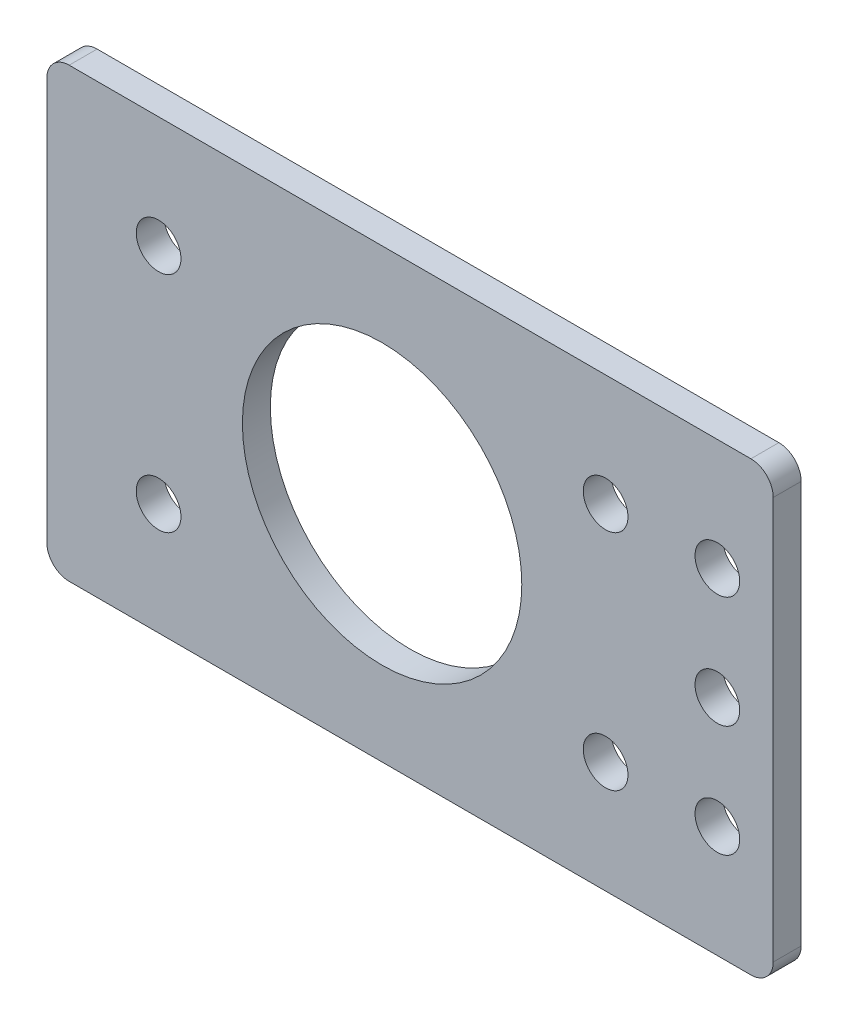
ISO-10303-21;
HEADER;
FILE_DESCRIPTION(('STEP AP214'),'2;1');
FILE_NAME('part.step','',(''),(''),'','','');
FILE_SCHEMA(('AUTOMOTIVE_DESIGN { 1 0 10303 214 1 1 1 1 }'));
ENDSEC;
DATA;
#1=APPLICATION_CONTEXT('core data for automotive mechanical design processes');
#2=APPLICATION_PROTOCOL_DEFINITION('international standard','automotive_design',2000,#1);
#3=PRODUCT_CONTEXT('',#1,'mechanical');
#4=PRODUCT('Part','Part','',(#3));
#5=PRODUCT_RELATED_PRODUCT_CATEGORY('part','',(#4));
#6=PRODUCT_DEFINITION_FORMATION('','',#4);
#7=PRODUCT_DEFINITION_CONTEXT('part definition',#1,'design');
#8=PRODUCT_DEFINITION('design','',#6,#7);
#9=PRODUCT_DEFINITION_SHAPE('','',#8);
#10=(LENGTH_UNIT() NAMED_UNIT(*) SI_UNIT(.MILLI.,.METRE.));
#11=(NAMED_UNIT(*) PLANE_ANGLE_UNIT() SI_UNIT($,.RADIAN.));
#12=(NAMED_UNIT(*) SI_UNIT($,.STERADIAN.) SOLID_ANGLE_UNIT());
#13=UNCERTAINTY_MEASURE_WITH_UNIT(LENGTH_MEASURE(1.E-05),#10,'distance_accuracy_value','');
#14=(GEOMETRIC_REPRESENTATION_CONTEXT(3) GLOBAL_UNCERTAINTY_ASSIGNED_CONTEXT((#13)) GLOBAL_UNIT_ASSIGNED_CONTEXT((#10,
#11,#12)) REPRESENTATION_CONTEXT('',''));
#15=CARTESIAN_POINT('',(0.,0.,0.));
#16=DIRECTION('',(0.,0.,1.));
#17=DIRECTION('',(1.,0.,0.));
#18=AXIS2_PLACEMENT_3D('',#15,#16,#17);
#19=CARTESIAN_POINT('',(0.,0.,3.175));
#20=DIRECTION('',(0.,0.,-1.));
#21=DIRECTION('',(-1.,0.,0.));
#22=AXIS2_PLACEMENT_3D('',#19,#20,#21);
#23=PLANE('',#22);
#24=CARTESIAN_POINT('',(-444.5,12.7,3.175));
#25=DIRECTION('',(0.,0.,1.));
#26=DIRECTION('',(1.,0.,0.));
#27=AXIS2_PLACEMENT_3D('',#24,#25,#26);
#28=CIRCLE('',#27,2.54000000000001);
#29=CARTESIAN_POINT('',(-441.96,12.7,3.175));
#30=VERTEX_POINT('',#29);
#31=EDGE_CURVE('E171',#30,#30,#28,.T.);
#32=ORIENTED_EDGE('',*,*,#31,.F.);
#33=EDGE_LOOP('',(#32));
#34=FACE_BOUND('',#33,.T.);
#35=CARTESIAN_POINT('',(-431.8,12.7,3.175));
#36=DIRECTION('',(0.,0.,1.));
#37=DIRECTION('',(1.,0.,0.));
#38=AXIS2_PLACEMENT_3D('',#35,#36,#37);
#39=CIRCLE('',#38,2.54000000000001);
#40=CARTESIAN_POINT('',(-429.26,12.7,3.175));
#41=VERTEX_POINT('',#40);
#42=EDGE_CURVE('E177',#41,#41,#39,.T.);
#43=ORIENTED_EDGE('',*,*,#42,.F.);
#44=EDGE_LOOP('',(#43));
#45=FACE_BOUND('',#44,.T.);
#46=CARTESIAN_POINT('',(-431.8,0.,3.175));
#47=DIRECTION('',(0.,0.,1.));
#48=DIRECTION('',(1.,0.,0.));
#49=AXIS2_PLACEMENT_3D('',#46,#47,#48);
#50=CIRCLE('',#49,2.54000000000001);
#51=CARTESIAN_POINT('',(-429.26,0.,3.175));
#52=VERTEX_POINT('',#51);
#53=EDGE_CURVE('E183',#52,#52,#50,.T.);
#54=ORIENTED_EDGE('',*,*,#53,.F.);
#55=EDGE_LOOP('',(#54));
#56=FACE_BOUND('',#55,.T.);
#57=CARTESIAN_POINT('',(-431.8,-12.7,3.175));
#58=DIRECTION('',(0.,0.,1.));
#59=DIRECTION('',(1.,0.,0.));
#60=AXIS2_PLACEMENT_3D('',#57,#58,#59);
#61=CIRCLE('',#60,2.54000000000001);
#62=CARTESIAN_POINT('',(-429.26,-12.7,3.175));
#63=VERTEX_POINT('',#62);
#64=EDGE_CURVE('E189',#63,#63,#61,.T.);
#65=ORIENTED_EDGE('',*,*,#64,.F.);
#66=EDGE_LOOP('',(#65));
#67=FACE_BOUND('',#66,.T.);
#68=CARTESIAN_POINT('',(-444.5,-12.7,3.175));
#69=DIRECTION('',(0.,0.,1.));
#70=DIRECTION('',(1.,0.,0.));
#71=AXIS2_PLACEMENT_3D('',#68,#69,#70);
#72=CIRCLE('',#71,2.54000000000001);
#73=CARTESIAN_POINT('',(-441.96,-12.7,3.175));
#74=VERTEX_POINT('',#73);
#75=EDGE_CURVE('E195',#74,#74,#72,.T.);
#76=ORIENTED_EDGE('',*,*,#75,.F.);
#77=EDGE_LOOP('',(#76));
#78=FACE_BOUND('',#77,.T.);
#79=CARTESIAN_POINT('',(-495.3,-12.7,3.175));
#80=DIRECTION('',(0.,0.,1.));
#81=DIRECTION('',(1.,0.,0.));
#82=AXIS2_PLACEMENT_3D('',#79,#80,#81);
#83=CIRCLE('',#82,2.54000000000001);
#84=CARTESIAN_POINT('',(-492.76,-12.7,3.175));
#85=VERTEX_POINT('',#84);
#86=EDGE_CURVE('E201',#85,#85,#83,.T.);
#87=ORIENTED_EDGE('',*,*,#86,.F.);
#88=EDGE_LOOP('',(#87));
#89=FACE_BOUND('',#88,.T.);
#90=CARTESIAN_POINT('',(-495.3,12.7,3.175));
#91=DIRECTION('',(0.,0.,1.));
#92=DIRECTION('',(1.,0.,0.));
#93=AXIS2_PLACEMENT_3D('',#90,#91,#92);
#94=CIRCLE('',#93,2.54000000000001);
#95=CARTESIAN_POINT('',(-492.76,12.7,3.175));
#96=VERTEX_POINT('',#95);
#97=EDGE_CURVE('E207',#96,#96,#94,.T.);
#98=ORIENTED_EDGE('',*,*,#97,.F.);
#99=EDGE_LOOP('',(#98));
#100=FACE_BOUND('',#99,.T.);
#101=CARTESIAN_POINT('',(-469.9,0.,3.175));
#102=DIRECTION('',(0.,0.,1.));
#103=DIRECTION('',(1.,0.,0.));
#104=AXIS2_PLACEMENT_3D('',#101,#102,#103);
#105=CIRCLE('',#104,15.875);
#106=CARTESIAN_POINT('',(-454.025,0.,3.175));
#107=VERTEX_POINT('',#106);
#108=EDGE_CURVE('E213',#107,#107,#105,.T.);
#109=ORIENTED_EDGE('',*,*,#108,.F.);
#110=EDGE_LOOP('',(#109));
#111=FACE_BOUND('',#110,.T.);
#112=DIRECTION('',(1.,0.,0.));
#113=VECTOR('',#112,1.);
#114=CARTESIAN_POINT('',(-481.624580264318,-25.4,3.175));
#115=LINE('',#114,#113);
#116=CARTESIAN_POINT('',(-505.46,-25.4,3.175));
#117=VERTEX_POINT('',#116);
#118=CARTESIAN_POINT('',(-427.99,-25.4000000000001,3.175));
#119=VERTEX_POINT('',#118);
#120=EDGE_CURVE('E120',#117,#119,#115,.T.);
#121=ORIENTED_EDGE('',*,*,#120,.T.);
#122=CARTESIAN_POINT('',(-427.99,-22.86,3.175));
#123=DIRECTION('',(0.,0.,-1.));
#124=DIRECTION('',(-1.,0.,0.));
#125=AXIS2_PLACEMENT_3D('',#122,#123,#124);
#126=CIRCLE('',#125,2.54);
#127=CARTESIAN_POINT('',(-425.45,-22.86,3.175));
#128=VERTEX_POINT('',#127);
#129=EDGE_CURVE('E140',#119,#128,#126,.F.);
#130=ORIENTED_EDGE('',*,*,#129,.T.);
#131=DIRECTION('',(0.,1.,0.));
#132=VECTOR('',#131,1.);
#133=CARTESIAN_POINT('',(-425.45,25.4,3.175));
#134=LINE('',#133,#132);
#135=CARTESIAN_POINT('',(-425.45,22.8599999999999,3.175));
#136=VERTEX_POINT('',#135);
#137=EDGE_CURVE('E163',#128,#136,#134,.T.);
#138=ORIENTED_EDGE('',*,*,#137,.T.);
#139=CARTESIAN_POINT('',(-427.99,22.8599999999999,3.175));
#140=DIRECTION('',(0.,0.,-1.));
#141=DIRECTION('',(-1.,0.,0.));
#142=AXIS2_PLACEMENT_3D('',#139,#140,#141);
#143=CIRCLE('',#142,2.54);
#144=CARTESIAN_POINT('',(-427.99,25.4,3.175));
#145=VERTEX_POINT('',#144);
#146=EDGE_CURVE('E138',#136,#145,#143,.F.);
#147=ORIENTED_EDGE('',*,*,#146,.T.);
#148=DIRECTION('',(-1.,0.,0.));
#149=VECTOR('',#148,1.);
#150=CARTESIAN_POINT('',(-431.8,25.4,3.175));
#151=LINE('',#150,#149);
#152=CARTESIAN_POINT('',(-505.46,25.4,3.175));
#153=VERTEX_POINT('',#152);
#154=EDGE_CURVE('E118',#145,#153,#151,.T.);
#155=ORIENTED_EDGE('',*,*,#154,.T.);
#156=CARTESIAN_POINT('',(-505.46,22.86,3.175));
#157=DIRECTION('',(0.,0.,-1.));
#158=DIRECTION('',(-1.,0.,0.));
#159=AXIS2_PLACEMENT_3D('',#156,#157,#158);
#160=CIRCLE('',#159,2.54);
#161=CARTESIAN_POINT('',(-508.,22.86,3.175));
#162=VERTEX_POINT('',#161);
#163=EDGE_CURVE('E117',#153,#162,#160,.F.);
#164=ORIENTED_EDGE('',*,*,#163,.T.);
#165=DIRECTION('',(0.,-1.,0.));
#166=VECTOR('',#165,1.);
#167=CARTESIAN_POINT('',(-508.,25.4,3.175));
#168=LINE('',#167,#166);
#169=CARTESIAN_POINT('',(-508.,-22.86,3.175));
#170=VERTEX_POINT('',#169);
#171=EDGE_CURVE('E103',#162,#170,#168,.T.);
#172=ORIENTED_EDGE('',*,*,#171,.T.);
#173=CARTESIAN_POINT('',(-505.46,-22.86,3.175));
#174=DIRECTION('',(0.,0.,-1.));
#175=DIRECTION('',(-1.,0.,0.));
#176=AXIS2_PLACEMENT_3D('',#173,#174,#175);
#177=CIRCLE('',#176,2.54);
#178=EDGE_CURVE('E126',#170,#117,#177,.F.);
#179=ORIENTED_EDGE('',*,*,#178,.T.);
#180=EDGE_LOOP('',(#121,#130,#138,#147,#155,#164,#172,#179));
#181=FACE_BOUND('',#180,.T.);
#182=ADVANCED_FACE('F34',(#34,#45,#56,#67,#78,#89,#100,#111,#181),#23,.F.);
#183=CARTESIAN_POINT('',(0.,0.,0.));
#184=DIRECTION('',(0.,0.,-1.));
#185=DIRECTION('',(-1.,0.,0.));
#186=AXIS2_PLACEMENT_3D('',#183,#184,#185);
#187=PLANE('',#186);
#188=CARTESIAN_POINT('',(-431.8,0.,0.));
#189=DIRECTION('',(0.,0.,1.));
#190=DIRECTION('',(1.,0.,0.));
#191=AXIS2_PLACEMENT_3D('',#188,#189,#190);
#192=CIRCLE('',#191,2.54000000000001);
#193=CARTESIAN_POINT('',(-429.26,0.,0.));
#194=VERTEX_POINT('',#193);
#195=EDGE_CURVE('E180',#194,#194,#192,.T.);
#196=ORIENTED_EDGE('',*,*,#195,.T.);
#197=EDGE_LOOP('',(#196));
#198=FACE_BOUND('',#197,.T.);
#199=CARTESIAN_POINT('',(-444.5,-12.7,0.));
#200=DIRECTION('',(0.,0.,1.));
#201=DIRECTION('',(1.,0.,0.));
#202=AXIS2_PLACEMENT_3D('',#199,#200,#201);
#203=CIRCLE('',#202,2.54000000000001);
#204=CARTESIAN_POINT('',(-441.96,-12.7,0.));
#205=VERTEX_POINT('',#204);
#206=EDGE_CURVE('E192',#205,#205,#203,.T.);
#207=ORIENTED_EDGE('',*,*,#206,.T.);
#208=EDGE_LOOP('',(#207));
#209=FACE_BOUND('',#208,.T.);
#210=CARTESIAN_POINT('',(-495.3,12.7,0.));
#211=DIRECTION('',(0.,0.,1.));
#212=DIRECTION('',(1.,0.,0.));
#213=AXIS2_PLACEMENT_3D('',#210,#211,#212);
#214=CIRCLE('',#213,2.54000000000001);
#215=CARTESIAN_POINT('',(-492.76,12.7,0.));
#216=VERTEX_POINT('',#215);
#217=EDGE_CURVE('E204',#216,#216,#214,.T.);
#218=ORIENTED_EDGE('',*,*,#217,.T.);
#219=EDGE_LOOP('',(#218));
#220=FACE_BOUND('',#219,.T.);
#221=CARTESIAN_POINT('',(-469.9,0.,0.));
#222=DIRECTION('',(0.,0.,1.));
#223=DIRECTION('',(1.,0.,0.));
#224=AXIS2_PLACEMENT_3D('',#221,#222,#223);
#225=CIRCLE('',#224,15.875);
#226=CARTESIAN_POINT('',(-454.025,0.,0.));
#227=VERTEX_POINT('',#226);
#228=EDGE_CURVE('E210',#227,#227,#225,.T.);
#229=ORIENTED_EDGE('',*,*,#228,.T.);
#230=EDGE_LOOP('',(#229));
#231=FACE_BOUND('',#230,.T.);
#232=CARTESIAN_POINT('',(-495.3,-12.7,0.));
#233=DIRECTION('',(0.,0.,1.));
#234=DIRECTION('',(1.,0.,0.));
#235=AXIS2_PLACEMENT_3D('',#232,#233,#234);
#236=CIRCLE('',#235,2.54000000000001);
#237=CARTESIAN_POINT('',(-492.76,-12.7,0.));
#238=VERTEX_POINT('',#237);
#239=EDGE_CURVE('E198',#238,#238,#236,.T.);
#240=ORIENTED_EDGE('',*,*,#239,.T.);
#241=EDGE_LOOP('',(#240));
#242=FACE_BOUND('',#241,.T.);
#243=CARTESIAN_POINT('',(-431.8,-12.7,0.));
#244=DIRECTION('',(0.,0.,1.));
#245=DIRECTION('',(1.,0.,0.));
#246=AXIS2_PLACEMENT_3D('',#243,#244,#245);
#247=CIRCLE('',#246,2.54000000000001);
#248=CARTESIAN_POINT('',(-429.26,-12.7,0.));
#249=VERTEX_POINT('',#248);
#250=EDGE_CURVE('E186',#249,#249,#247,.T.);
#251=ORIENTED_EDGE('',*,*,#250,.T.);
#252=EDGE_LOOP('',(#251));
#253=FACE_BOUND('',#252,.T.);
#254=CARTESIAN_POINT('',(-431.8,12.7,0.));
#255=DIRECTION('',(0.,0.,1.));
#256=DIRECTION('',(1.,0.,0.));
#257=AXIS2_PLACEMENT_3D('',#254,#255,#256);
#258=CIRCLE('',#257,2.54000000000001);
#259=CARTESIAN_POINT('',(-429.26,12.7,0.));
#260=VERTEX_POINT('',#259);
#261=EDGE_CURVE('E174',#260,#260,#258,.T.);
#262=ORIENTED_EDGE('',*,*,#261,.T.);
#263=EDGE_LOOP('',(#262));
#264=FACE_BOUND('',#263,.T.);
#265=CARTESIAN_POINT('',(-444.5,12.7,0.));
#266=DIRECTION('',(0.,0.,1.));
#267=DIRECTION('',(1.,0.,0.));
#268=AXIS2_PLACEMENT_3D('',#265,#266,#267);
#269=CIRCLE('',#268,2.54000000000001);
#270=CARTESIAN_POINT('',(-441.96,12.7,0.));
#271=VERTEX_POINT('',#270);
#272=EDGE_CURVE('E168',#271,#271,#269,.T.);
#273=ORIENTED_EDGE('',*,*,#272,.T.);
#274=EDGE_LOOP('',(#273));
#275=FACE_BOUND('',#274,.T.);
#276=DIRECTION('',(0.,1.,0.));
#277=VECTOR('',#276,1.);
#278=CARTESIAN_POINT('',(-425.45,25.4,0.));
#279=LINE('',#278,#277);
#280=CARTESIAN_POINT('',(-425.45,-22.86,0.));
#281=VERTEX_POINT('',#280);
#282=CARTESIAN_POINT('',(-425.45,22.8599999999999,0.));
#283=VERTEX_POINT('',#282);
#284=EDGE_CURVE('E150',#281,#283,#279,.T.);
#285=ORIENTED_EDGE('',*,*,#284,.F.);
#286=CARTESIAN_POINT('',(-427.99,-22.86,0.));
#287=DIRECTION('',(0.,0.,-1.));
#288=DIRECTION('',(-1.,0.,0.));
#289=AXIS2_PLACEMENT_3D('',#286,#287,#288);
#290=CIRCLE('',#289,2.54);
#291=CARTESIAN_POINT('',(-427.99,-25.4,0.));
#292=VERTEX_POINT('',#291);
#293=EDGE_CURVE('E42',#281,#292,#290,.T.);
#294=ORIENTED_EDGE('',*,*,#293,.T.);
#295=DIRECTION('',(1.,0.,0.));
#296=VECTOR('',#295,1.);
#297=CARTESIAN_POINT('',(-368.3,-25.4,0.));
#298=LINE('',#297,#296);
#299=CARTESIAN_POINT('',(-505.46,-25.4,0.));
#300=VERTEX_POINT('',#299);
#301=EDGE_CURVE('E104',#300,#292,#298,.T.);
#302=ORIENTED_EDGE('',*,*,#301,.F.);
#303=CARTESIAN_POINT('',(-505.46,-22.86,0.));
#304=DIRECTION('',(0.,0.,-1.));
#305=DIRECTION('',(-1.,0.,0.));
#306=AXIS2_PLACEMENT_3D('',#303,#304,#305);
#307=CIRCLE('',#306,2.54);
#308=CARTESIAN_POINT('',(-508.,-22.86,0.));
#309=VERTEX_POINT('',#308);
#310=EDGE_CURVE('E114',#300,#309,#307,.T.);
#311=ORIENTED_EDGE('',*,*,#310,.T.);
#312=DIRECTION('',(0.,-1.,0.));
#313=VECTOR('',#312,1.);
#314=CARTESIAN_POINT('',(-508.,25.4,0.));
#315=LINE('',#314,#313);
#316=CARTESIAN_POINT('',(-508.,22.86,0.));
#317=VERTEX_POINT('',#316);
#318=EDGE_CURVE('E110',#317,#309,#315,.T.);
#319=ORIENTED_EDGE('',*,*,#318,.F.);
#320=CARTESIAN_POINT('',(-505.46,22.86,0.));
#321=DIRECTION('',(0.,0.,-1.));
#322=DIRECTION('',(-1.,0.,0.));
#323=AXIS2_PLACEMENT_3D('',#320,#321,#322);
#324=CIRCLE('',#323,2.54);
#325=CARTESIAN_POINT('',(-505.46,25.4,0.));
#326=VERTEX_POINT('',#325);
#327=EDGE_CURVE('E107',#317,#326,#324,.T.);
#328=ORIENTED_EDGE('',*,*,#327,.T.);
#329=DIRECTION('',(-1.,0.,0.));
#330=VECTOR('',#329,1.);
#331=CARTESIAN_POINT('',(-508.,25.4,0.));
#332=LINE('',#331,#330);
#333=CARTESIAN_POINT('',(-427.99,25.3999999999999,0.));
#334=VERTEX_POINT('',#333);
#335=EDGE_CURVE('E97',#334,#326,#332,.T.);
#336=ORIENTED_EDGE('',*,*,#335,.F.);
#337=CARTESIAN_POINT('',(-427.99,22.8599999999999,0.));
#338=DIRECTION('',(0.,0.,-1.));
#339=DIRECTION('',(-1.,0.,0.));
#340=AXIS2_PLACEMENT_3D('',#337,#338,#339);
#341=CIRCLE('',#340,2.54);
#342=EDGE_CURVE('E54',#334,#283,#341,.T.);
#343=ORIENTED_EDGE('',*,*,#342,.T.);
#344=EDGE_LOOP('',(#285,#294,#302,#311,#319,#328,#336,#343));
#345=FACE_BOUND('',#344,.T.);
#346=ADVANCED_FACE('F108',(#198,#209,#220,#231,#242,#253,#264,#275,#345),#187,.T.);
#347=CARTESIAN_POINT('',(-368.3,-25.4,3.175));
#348=DIRECTION('',(0.,1.,0.));
#349=DIRECTION('',(-1.,0.,0.));
#350=AXIS2_PLACEMENT_3D('',#347,#348,#349);
#351=PLANE('',#350);
#352=ORIENTED_EDGE('',*,*,#301,.T.);
#353=DIRECTION('',(0.,0.,1.));
#354=VECTOR('',#353,1.);
#355=CARTESIAN_POINT('',(-427.99,-25.4,3.175));
#356=LINE('',#355,#354);
#357=EDGE_CURVE('E135',#292,#119,#356,.T.);
#358=ORIENTED_EDGE('',*,*,#357,.T.);
#359=ORIENTED_EDGE('',*,*,#120,.F.);
#360=DIRECTION('',(0.,0.,-1.));
#361=VECTOR('',#360,1.);
#362=CARTESIAN_POINT('',(-505.46,-25.4,3.175));
#363=LINE('',#362,#361);
#364=EDGE_CURVE('E128',#117,#300,#363,.T.);
#365=ORIENTED_EDGE('',*,*,#364,.T.);
#366=EDGE_LOOP('',(#352,#358,#359,#365));
#367=FACE_BOUND('',#366,.T.);
#368=ADVANCED_FACE('F155',(#367),#351,.F.);
#369=CARTESIAN_POINT('',(-508.,25.4,3.175));
#370=DIRECTION('',(0.,-1.,0.));
#371=DIRECTION('',(1.,0.,0.));
#372=AXIS2_PLACEMENT_3D('',#369,#370,#371);
#373=PLANE('',#372);
#374=ORIENTED_EDGE('',*,*,#154,.F.);
#375=DIRECTION('',(0.,0.,1.));
#376=VECTOR('',#375,1.);
#377=CARTESIAN_POINT('',(-427.99,25.3999999999999,0.));
#378=LINE('',#377,#376);
#379=EDGE_CURVE('E12',#145,#334,#378,.F.);
#380=ORIENTED_EDGE('',*,*,#379,.T.);
#381=ORIENTED_EDGE('',*,*,#335,.T.);
#382=DIRECTION('',(0.,0.,-1.));
#383=VECTOR('',#382,1.);
#384=CARTESIAN_POINT('',(-505.46,25.4,3.175));
#385=LINE('',#384,#383);
#386=EDGE_CURVE('E101',#326,#153,#385,.F.);
#387=ORIENTED_EDGE('',*,*,#386,.T.);
#388=EDGE_LOOP('',(#374,#380,#381,#387));
#389=FACE_BOUND('',#388,.T.);
#390=ADVANCED_FACE('F99',(#389),#373,.F.);
#391=CARTESIAN_POINT('',(-508.,25.4,3.175));
#392=DIRECTION('',(1.,0.,0.));
#393=DIRECTION('',(0.,0.,-1.));
#394=AXIS2_PLACEMENT_3D('',#391,#392,#393);
#395=PLANE('',#394);
#396=ORIENTED_EDGE('',*,*,#318,.T.);
#397=DIRECTION('',(0.,0.,-1.));
#398=VECTOR('',#397,1.);
#399=CARTESIAN_POINT('',(-508.,-22.86,3.175));
#400=LINE('',#399,#398);
#401=EDGE_CURVE('E133',#309,#170,#400,.F.);
#402=ORIENTED_EDGE('',*,*,#401,.T.);
#403=ORIENTED_EDGE('',*,*,#171,.F.);
#404=DIRECTION('',(0.,0.,-1.));
#405=VECTOR('',#404,1.);
#406=CARTESIAN_POINT('',(-508.,22.86,3.175));
#407=LINE('',#406,#405);
#408=EDGE_CURVE('E131',#162,#317,#407,.T.);
#409=ORIENTED_EDGE('',*,*,#408,.T.);
#410=EDGE_LOOP('',(#396,#402,#403,#409));
#411=FACE_BOUND('',#410,.T.);
#412=ADVANCED_FACE('F223',(#411),#395,.F.);
#413=CARTESIAN_POINT('',(-469.9,0.,3.175));
#414=DIRECTION('',(0.,0.,-1.));
#415=DIRECTION('',(-1.,0.,0.));
#416=AXIS2_PLACEMENT_3D('',#413,#414,#415);
#417=CYLINDRICAL_SURFACE('',#416,15.875);
#418=ORIENTED_EDGE('',*,*,#108,.T.);
#419=EDGE_LOOP('',(#418));
#420=FACE_BOUND('',#419,.T.);
#421=ORIENTED_EDGE('',*,*,#228,.F.);
#422=EDGE_LOOP('',(#421));
#423=FACE_BOUND('',#422,.T.);
#424=ADVANCED_FACE('F244',(#420,#423),#417,.F.);
#425=CARTESIAN_POINT('',(-495.3,12.7,3.175));
#426=DIRECTION('',(0.,0.,-1.));
#427=DIRECTION('',(-1.,0.,0.));
#428=AXIS2_PLACEMENT_3D('',#425,#426,#427);
#429=CYLINDRICAL_SURFACE('',#428,2.54000000000001);
#430=ORIENTED_EDGE('',*,*,#97,.T.);
#431=EDGE_LOOP('',(#430));
#432=FACE_BOUND('',#431,.T.);
#433=ORIENTED_EDGE('',*,*,#217,.F.);
#434=EDGE_LOOP('',(#433));
#435=FACE_BOUND('',#434,.T.);
#436=ADVANCED_FACE('F285',(#432,#435),#429,.F.);
#437=CARTESIAN_POINT('',(-495.3,-12.7,3.175));
#438=DIRECTION('',(0.,0.,-1.));
#439=DIRECTION('',(-1.,0.,0.));
#440=AXIS2_PLACEMENT_3D('',#437,#438,#439);
#441=CYLINDRICAL_SURFACE('',#440,2.54000000000001);
#442=ORIENTED_EDGE('',*,*,#86,.T.);
#443=EDGE_LOOP('',(#442));
#444=FACE_BOUND('',#443,.T.);
#445=ORIENTED_EDGE('',*,*,#239,.F.);
#446=EDGE_LOOP('',(#445));
#447=FACE_BOUND('',#446,.T.);
#448=ADVANCED_FACE('F282',(#444,#447),#441,.F.);
#449=CARTESIAN_POINT('',(-444.5,-12.7,3.175));
#450=DIRECTION('',(0.,0.,-1.));
#451=DIRECTION('',(-1.,0.,0.));
#452=AXIS2_PLACEMENT_3D('',#449,#450,#451);
#453=CYLINDRICAL_SURFACE('',#452,2.54000000000001);
#454=ORIENTED_EDGE('',*,*,#75,.T.);
#455=EDGE_LOOP('',(#454));
#456=FACE_BOUND('',#455,.T.);
#457=ORIENTED_EDGE('',*,*,#206,.F.);
#458=EDGE_LOOP('',(#457));
#459=FACE_BOUND('',#458,.T.);
#460=ADVANCED_FACE('F278',(#456,#459),#453,.F.);
#461=CARTESIAN_POINT('',(-431.8,-12.7,3.175));
#462=DIRECTION('',(0.,0.,-1.));
#463=DIRECTION('',(-1.,0.,0.));
#464=AXIS2_PLACEMENT_3D('',#461,#462,#463);
#465=CYLINDRICAL_SURFACE('',#464,2.54000000000001);
#466=ORIENTED_EDGE('',*,*,#64,.T.);
#467=EDGE_LOOP('',(#466));
#468=FACE_BOUND('',#467,.T.);
#469=ORIENTED_EDGE('',*,*,#250,.F.);
#470=EDGE_LOOP('',(#469));
#471=FACE_BOUND('',#470,.T.);
#472=ADVANCED_FACE('F274',(#468,#471),#465,.F.);
#473=CARTESIAN_POINT('',(-431.8,0.,3.175));
#474=DIRECTION('',(0.,0.,-1.));
#475=DIRECTION('',(-1.,0.,0.));
#476=AXIS2_PLACEMENT_3D('',#473,#474,#475);
#477=CYLINDRICAL_SURFACE('',#476,2.54000000000001);
#478=ORIENTED_EDGE('',*,*,#53,.T.);
#479=EDGE_LOOP('',(#478));
#480=FACE_BOUND('',#479,.T.);
#481=ORIENTED_EDGE('',*,*,#195,.F.);
#482=EDGE_LOOP('',(#481));
#483=FACE_BOUND('',#482,.T.);
#484=ADVANCED_FACE('F270',(#480,#483),#477,.F.);
#485=CARTESIAN_POINT('',(-431.8,12.7,3.175));
#486=DIRECTION('',(0.,0.,-1.));
#487=DIRECTION('',(-1.,0.,0.));
#488=AXIS2_PLACEMENT_3D('',#485,#486,#487);
#489=CYLINDRICAL_SURFACE('',#488,2.54000000000001);
#490=ORIENTED_EDGE('',*,*,#42,.T.);
#491=EDGE_LOOP('',(#490));
#492=FACE_BOUND('',#491,.T.);
#493=ORIENTED_EDGE('',*,*,#261,.F.);
#494=EDGE_LOOP('',(#493));
#495=FACE_BOUND('',#494,.T.);
#496=ADVANCED_FACE('F266',(#492,#495),#489,.F.);
#497=CARTESIAN_POINT('',(-444.5,12.7,3.175));
#498=DIRECTION('',(0.,0.,-1.));
#499=DIRECTION('',(-1.,0.,0.));
#500=AXIS2_PLACEMENT_3D('',#497,#498,#499);
#501=CYLINDRICAL_SURFACE('',#500,2.54000000000001);
#502=ORIENTED_EDGE('',*,*,#31,.T.);
#503=EDGE_LOOP('',(#502));
#504=FACE_BOUND('',#503,.T.);
#505=ORIENTED_EDGE('',*,*,#272,.F.);
#506=EDGE_LOOP('',(#505));
#507=FACE_BOUND('',#506,.T.);
#508=ADVANCED_FACE('F255',(#504,#507),#501,.F.);
#509=CARTESIAN_POINT('',(-505.46,-22.86,3.175));
#510=DIRECTION('',(0.,0.,-1.));
#511=DIRECTION('',(-1.,0.,0.));
#512=AXIS2_PLACEMENT_3D('',#509,#510,#511);
#513=CYLINDRICAL_SURFACE('',#512,2.54);
#514=ORIENTED_EDGE('',*,*,#178,.F.);
#515=ORIENTED_EDGE('',*,*,#401,.F.);
#516=ORIENTED_EDGE('',*,*,#310,.F.);
#517=ORIENTED_EDGE('',*,*,#364,.F.);
#518=EDGE_LOOP('',(#514,#515,#516,#517));
#519=FACE_BOUND('',#518,.T.);
#520=ADVANCED_FACE('F227',(#519),#513,.T.);
#521=CARTESIAN_POINT('',(-505.46,22.86,3.175));
#522=DIRECTION('',(0.,0.,-1.));
#523=DIRECTION('',(-1.,0.,0.));
#524=AXIS2_PLACEMENT_3D('',#521,#522,#523);
#525=CYLINDRICAL_SURFACE('',#524,2.54);
#526=ORIENTED_EDGE('',*,*,#163,.F.);
#527=ORIENTED_EDGE('',*,*,#386,.F.);
#528=ORIENTED_EDGE('',*,*,#327,.F.);
#529=ORIENTED_EDGE('',*,*,#408,.F.);
#530=EDGE_LOOP('',(#526,#527,#528,#529));
#531=FACE_BOUND('',#530,.T.);
#532=ADVANCED_FACE('F116',(#531),#525,.T.);
#533=CARTESIAN_POINT('',(-425.45,25.4,0.));
#534=DIRECTION('',(1.,0.,0.));
#535=DIRECTION('',(0.,0.,-1.));
#536=AXIS2_PLACEMENT_3D('',#533,#534,#535);
#537=PLANE('',#536);
#538=ORIENTED_EDGE('',*,*,#137,.F.);
#539=DIRECTION('',(0.,0.,1.));
#540=VECTOR('',#539,1.);
#541=CARTESIAN_POINT('',(-425.45,-22.86,0.));
#542=LINE('',#541,#540);
#543=EDGE_CURVE('E145',#128,#281,#542,.F.);
#544=ORIENTED_EDGE('',*,*,#543,.T.);
#545=ORIENTED_EDGE('',*,*,#284,.T.);
#546=DIRECTION('',(0.,0.,1.));
#547=VECTOR('',#546,1.);
#548=CARTESIAN_POINT('',(-425.45,22.8599999999999,3.175));
#549=LINE('',#548,#547);
#550=EDGE_CURVE('E142',#283,#136,#549,.T.);
#551=ORIENTED_EDGE('',*,*,#550,.T.);
#552=EDGE_LOOP('',(#538,#544,#545,#551));
#553=FACE_BOUND('',#552,.T.);
#554=ADVANCED_FACE('F165',(#553),#537,.T.);
#555=CARTESIAN_POINT('',(-427.99,-22.86,3.175));
#556=DIRECTION('',(0.,0.,-1.));
#557=DIRECTION('',(-1.,0.,0.));
#558=AXIS2_PLACEMENT_3D('',#555,#556,#557);
#559=CYLINDRICAL_SURFACE('',#558,2.54);
#560=ORIENTED_EDGE('',*,*,#293,.F.);
#561=ORIENTED_EDGE('',*,*,#543,.F.);
#562=ORIENTED_EDGE('',*,*,#129,.F.);
#563=ORIENTED_EDGE('',*,*,#357,.F.);
#564=EDGE_LOOP('',(#560,#561,#562,#563));
#565=FACE_BOUND('',#564,.T.);
#566=ADVANCED_FACE('F159',(#565),#559,.T.);
#567=CARTESIAN_POINT('',(-427.99,22.8599999999999,0.));
#568=DIRECTION('',(0.,0.,-1.));
#569=DIRECTION('',(-1.,0.,0.));
#570=AXIS2_PLACEMENT_3D('',#567,#568,#569);
#571=CYLINDRICAL_SURFACE('',#570,2.54);
#572=ORIENTED_EDGE('',*,*,#342,.F.);
#573=ORIENTED_EDGE('',*,*,#379,.F.);
#574=ORIENTED_EDGE('',*,*,#146,.F.);
#575=ORIENTED_EDGE('',*,*,#550,.F.);
#576=EDGE_LOOP('',(#572,#573,#574,#575));
#577=FACE_BOUND('',#576,.T.);
#578=ADVANCED_FACE('F36',(#577),#571,.T.);
#579=CLOSED_SHELL('',(#182,#346,#368,#390,#412,#424,#436,#448,#460,#472,#484,#496,#508,#520,
#532,#554,#566,#578));
#580=MANIFOLD_SOLID_BREP('B2',#579);
#581=ADVANCED_BREP_SHAPE_REPRESENTATION('',(#18,#580),#14);
#582=SHAPE_DEFINITION_REPRESENTATION(#9,#581);
ENDSEC;
END-ISO-10303-21;
